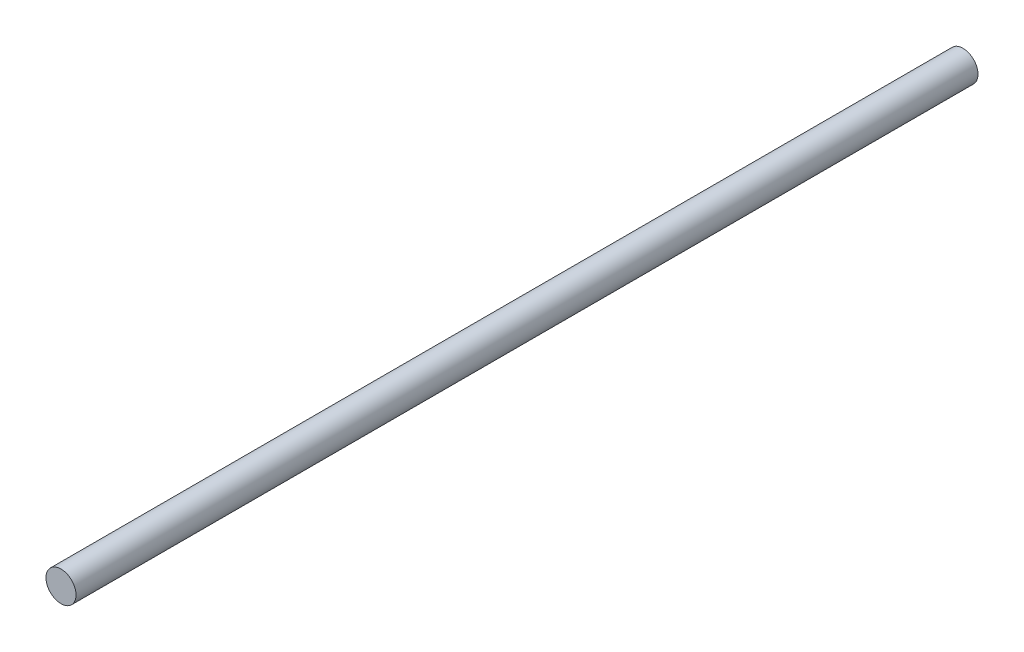
ISO-10303-21;
HEADER;
FILE_DESCRIPTION(('STEP AP214'),'2;1');
FILE_NAME('part.step','',(''),(''),'','','');
FILE_SCHEMA(('AUTOMOTIVE_DESIGN { 1 0 10303 214 1 1 1 1 }'));
ENDSEC;
DATA;
#1=APPLICATION_CONTEXT('core data for automotive mechanical design processes');
#2=APPLICATION_PROTOCOL_DEFINITION('international standard','automotive_design',2000,#1);
#3=PRODUCT_CONTEXT('',#1,'mechanical');
#4=PRODUCT('Part','Part','',(#3));
#5=PRODUCT_RELATED_PRODUCT_CATEGORY('part','',(#4));
#6=PRODUCT_DEFINITION_FORMATION('','',#4);
#7=PRODUCT_DEFINITION_CONTEXT('part definition',#1,'design');
#8=PRODUCT_DEFINITION('design','',#6,#7);
#9=PRODUCT_DEFINITION_SHAPE('','',#8);
#10=(LENGTH_UNIT() NAMED_UNIT(*) SI_UNIT(.MILLI.,.METRE.));
#11=(NAMED_UNIT(*) PLANE_ANGLE_UNIT() SI_UNIT($,.RADIAN.));
#12=(NAMED_UNIT(*) SI_UNIT($,.STERADIAN.) SOLID_ANGLE_UNIT());
#13=UNCERTAINTY_MEASURE_WITH_UNIT(LENGTH_MEASURE(1.E-05),#10,'distance_accuracy_value','');
#14=(GEOMETRIC_REPRESENTATION_CONTEXT(3) GLOBAL_UNCERTAINTY_ASSIGNED_CONTEXT((#13)) GLOBAL_UNIT_ASSIGNED_CONTEXT((#10,
#11,#12)) REPRESENTATION_CONTEXT('',''));
#15=CARTESIAN_POINT('',(0.,0.,0.));
#16=DIRECTION('',(0.,0.,1.));
#17=DIRECTION('',(1.,0.,0.));
#18=AXIS2_PLACEMENT_3D('',#15,#16,#17);
#19=CARTESIAN_POINT('',(0.,0.,95.25));
#20=DIRECTION('',(0.,0.,-1.));
#21=DIRECTION('',(-1.,0.,0.));
#22=AXIS2_PLACEMENT_3D('',#19,#20,#21);
#23=CYLINDRICAL_SURFACE('',#22,1.5875);
#24=CARTESIAN_POINT('',(0.,0.,95.25));
#25=DIRECTION('',(0.,0.,1.));
#26=DIRECTION('',(1.,0.,0.));
#27=AXIS2_PLACEMENT_3D('',#24,#25,#26);
#28=CIRCLE('',#27,1.5875);
#29=CARTESIAN_POINT('',(1.5875,0.,95.25));
#30=VERTEX_POINT('',#29);
#31=EDGE_CURVE('E10',#30,#30,#28,.T.);
#32=ORIENTED_EDGE('',*,*,#31,.F.);
#33=EDGE_LOOP('',(#32));
#34=FACE_BOUND('',#33,.T.);
#35=CARTESIAN_POINT('',(0.,0.,0.));
#36=DIRECTION('',(0.,0.,1.));
#37=DIRECTION('',(1.,0.,0.));
#38=AXIS2_PLACEMENT_3D('',#35,#36,#37);
#39=CIRCLE('',#38,1.5875);
#40=CARTESIAN_POINT('',(1.5875,0.,0.));
#41=VERTEX_POINT('',#40);
#42=EDGE_CURVE('E40',#41,#41,#39,.T.);
#43=ORIENTED_EDGE('',*,*,#42,.T.);
#44=EDGE_LOOP('',(#43));
#45=FACE_BOUND('',#44,.T.);
#46=ADVANCED_FACE('F37',(#34,#45),#23,.T.);
#47=CARTESIAN_POINT('',(0.,0.,95.25));
#48=DIRECTION('',(0.,0.,1.));
#49=DIRECTION('',(1.,0.,0.));
#50=AXIS2_PLACEMENT_3D('',#47,#48,#49);
#51=PLANE('',#50);
#52=ORIENTED_EDGE('',*,*,#31,.T.);
#53=EDGE_LOOP('',(#52));
#54=FACE_BOUND('',#53,.T.);
#55=ADVANCED_FACE('F54',(#54),#51,.T.);
#56=CARTESIAN_POINT('',(0.,0.,0.));
#57=DIRECTION('',(0.,0.,1.));
#58=DIRECTION('',(1.,0.,0.));
#59=AXIS2_PLACEMENT_3D('',#56,#57,#58);
#60=PLANE('',#59);
#61=ORIENTED_EDGE('',*,*,#42,.F.);
#62=EDGE_LOOP('',(#61));
#63=FACE_BOUND('',#62,.T.);
#64=ADVANCED_FACE('F52',(#63),#60,.F.);
#65=CLOSED_SHELL('',(#46,#55,#64));
#66=MANIFOLD_SOLID_BREP('B2',#65);
#67=ADVANCED_BREP_SHAPE_REPRESENTATION('',(#18,#66),#14);
#68=SHAPE_DEFINITION_REPRESENTATION(#9,#67);
ENDSEC;
END-ISO-10303-21;
